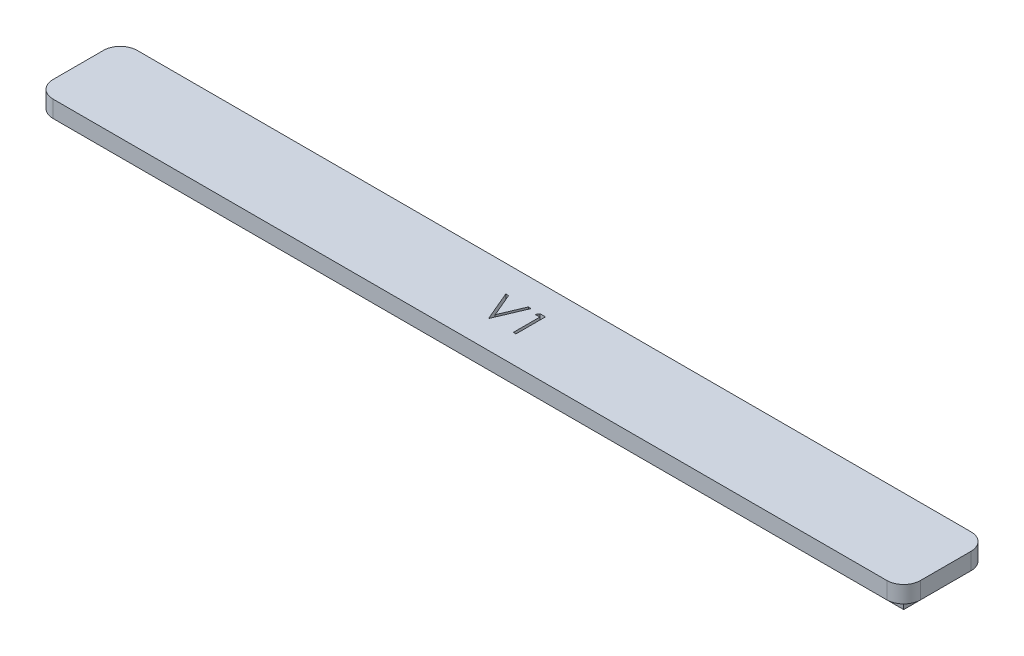
ISO-10303-21;
HEADER;
FILE_DESCRIPTION(('STEP AP214'),'2;1');
FILE_NAME('part.step','',(''),(''),'','','');
FILE_SCHEMA(('AUTOMOTIVE_DESIGN { 1 0 10303 214 1 1 1 1 }'));
ENDSEC;
DATA;
#1=APPLICATION_CONTEXT('core data for automotive mechanical design processes');
#2=APPLICATION_PROTOCOL_DEFINITION('international standard','automotive_design',2000,#1);
#3=PRODUCT_CONTEXT('',#1,'mechanical');
#4=PRODUCT('Part','Part','',(#3));
#5=PRODUCT_RELATED_PRODUCT_CATEGORY('part','',(#4));
#6=PRODUCT_DEFINITION_FORMATION('','',#4);
#7=PRODUCT_DEFINITION_CONTEXT('part definition',#1,'design');
#8=PRODUCT_DEFINITION('design','',#6,#7);
#9=PRODUCT_DEFINITION_SHAPE('','',#8);
#10=(LENGTH_UNIT() NAMED_UNIT(*) SI_UNIT(.MILLI.,.METRE.));
#11=(NAMED_UNIT(*) PLANE_ANGLE_UNIT() SI_UNIT($,.RADIAN.));
#12=(NAMED_UNIT(*) SI_UNIT($,.STERADIAN.) SOLID_ANGLE_UNIT());
#13=UNCERTAINTY_MEASURE_WITH_UNIT(LENGTH_MEASURE(1.E-05),#10,'distance_accuracy_value','');
#14=(GEOMETRIC_REPRESENTATION_CONTEXT(3) GLOBAL_UNCERTAINTY_ASSIGNED_CONTEXT((#13)) GLOBAL_UNIT_ASSIGNED_CONTEXT((#10,
#11,#12)) REPRESENTATION_CONTEXT('',''));
#15=CARTESIAN_POINT('',(0.,0.,0.));
#16=DIRECTION('',(0.,0.,1.));
#17=DIRECTION('',(1.,0.,0.));
#18=AXIS2_PLACEMENT_3D('',#15,#16,#17);
#19=CARTESIAN_POINT('',(0.,4.,0.));
#20=DIRECTION('',(0.,1.,0.));
#21=DIRECTION('',(0.,0.,1.));
#22=AXIS2_PLACEMENT_3D('',#19,#20,#21);
#23=PLANE('',#22);
#24=DIRECTION('',(-1.,0.,0.));
#25=VECTOR('',#24,1.);
#26=CARTESIAN_POINT('',(51.5,4.,-5.));
#27=LINE('',#26,#25);
#28=CARTESIAN_POINT('',(49.5,4.,-5.));
#29=VERTEX_POINT('',#28);
#30=CARTESIAN_POINT('',(-49.5,4.,-5.));
#31=VERTEX_POINT('',#30);
#32=EDGE_CURVE('E284',#29,#31,#27,.T.);
#33=ORIENTED_EDGE('',*,*,#32,.T.);
#34=CARTESIAN_POINT('',(-49.5,4.,-3.));
#35=DIRECTION('',(0.,1.,0.));
#36=DIRECTION('',(0.,0.,1.));
#37=AXIS2_PLACEMENT_3D('',#34,#35,#36);
#38=CIRCLE('',#37,2.);
#39=CARTESIAN_POINT('',(-51.5,4.,-3.));
#40=VERTEX_POINT('',#39);
#41=EDGE_CURVE('E344',#31,#40,#38,.T.);
#42=ORIENTED_EDGE('',*,*,#41,.T.);
#43=DIRECTION('',(0.,0.,1.));
#44=VECTOR('',#43,1.);
#45=CARTESIAN_POINT('',(-51.5,4.,-5.));
#46=LINE('',#45,#44);
#47=CARTESIAN_POINT('',(-51.5,4.,3.));
#48=VERTEX_POINT('',#47);
#49=EDGE_CURVE('E229',#40,#48,#46,.T.);
#50=ORIENTED_EDGE('',*,*,#49,.T.);
#51=CARTESIAN_POINT('',(-49.5,4.,3.));
#52=DIRECTION('',(0.,1.,0.));
#53=DIRECTION('',(0.,0.,1.));
#54=AXIS2_PLACEMENT_3D('',#51,#52,#53);
#55=CIRCLE('',#54,2.);
#56=CARTESIAN_POINT('',(-49.5,4.,5.));
#57=VERTEX_POINT('',#56);
#58=EDGE_CURVE('E338',#48,#57,#55,.T.);
#59=ORIENTED_EDGE('',*,*,#58,.T.);
#60=DIRECTION('',(1.,0.,0.));
#61=VECTOR('',#60,1.);
#62=CARTESIAN_POINT('',(-51.5,4.,5.));
#63=LINE('',#62,#61);
#64=CARTESIAN_POINT('',(49.5,4.,5.));
#65=VERTEX_POINT('',#64);
#66=EDGE_CURVE('E233',#57,#65,#63,.T.);
#67=ORIENTED_EDGE('',*,*,#66,.T.);
#68=CARTESIAN_POINT('',(49.5,4.,3.));
#69=DIRECTION('',(0.,1.,0.));
#70=DIRECTION('',(0.,0.,1.));
#71=AXIS2_PLACEMENT_3D('',#68,#69,#70);
#72=CIRCLE('',#71,2.);
#73=CARTESIAN_POINT('',(51.5,4.,3.));
#74=VERTEX_POINT('',#73);
#75=EDGE_CURVE('E340',#65,#74,#72,.T.);
#76=ORIENTED_EDGE('',*,*,#75,.T.);
#77=DIRECTION('',(0.,0.,-1.));
#78=VECTOR('',#77,1.);
#79=CARTESIAN_POINT('',(51.5,4.,5.));
#80=LINE('',#79,#78);
#81=CARTESIAN_POINT('',(51.5,4.,-3.));
#82=VERTEX_POINT('',#81);
#83=EDGE_CURVE('E296',#74,#82,#80,.T.);
#84=ORIENTED_EDGE('',*,*,#83,.T.);
#85=CARTESIAN_POINT('',(49.5,4.,-3.));
#86=DIRECTION('',(0.,1.,0.));
#87=DIRECTION('',(0.,0.,1.));
#88=AXIS2_PLACEMENT_3D('',#85,#86,#87);
#89=CIRCLE('',#88,2.);
#90=EDGE_CURVE('E342',#82,#29,#89,.T.);
#91=ORIENTED_EDGE('',*,*,#90,.T.);
#92=EDGE_LOOP('',(#33,#42,#50,#59,#67,#76,#84,#91));
#93=FACE_BOUND('',#92,.T.);
#94=DIRECTION('',(-1.,0.,0.));
#95=VECTOR('',#94,1.);
#96=CARTESIAN_POINT('',(1.82228761965457,4.,-1.47577383010594));
#97=LINE('',#96,#95);
#98=CARTESIAN_POINT('',(1.82228761965457,4.,-1.47577383010594));
#99=VERTEX_POINT('',#98);
#100=CARTESIAN_POINT('',(1.28382608119303,4.,-1.47577383010594));
#101=VERTEX_POINT('',#100);
#102=EDGE_CURVE('E243',#99,#101,#97,.T.);
#103=ORIENTED_EDGE('',*,*,#102,.T.);
#104=DIRECTION('',(0.496686511837685,0.,-0.867930013859708));
#105=VECTOR('',#104,1.);
#106=CARTESIAN_POINT('',(1.28382608119303,4.,-1.47577383010594));
#107=LINE('',#106,#105);
#108=CARTESIAN_POINT('',(1.48925476709047,4.,-1.8347481890803));
#109=VERTEX_POINT('',#108);
#110=EDGE_CURVE('E62',#101,#109,#107,.T.);
#111=ORIENTED_EDGE('',*,*,#110,.T.);
#112=DIRECTION('',(1.,0.,0.));
#113=VECTOR('',#112,1.);
#114=CARTESIAN_POINT('',(1.48925476709047,4.,-1.8347481890803));
#115=LINE('',#114,#113);
#116=CARTESIAN_POINT('',(2.13639018375714,4.,-1.8347481890803));
#117=VERTEX_POINT('',#116);
#118=EDGE_CURVE('E255',#109,#117,#115,.T.);
#119=ORIENTED_EDGE('',*,*,#118,.T.);
#120=DIRECTION('',(0.,0.,1.));
#121=VECTOR('',#120,1.);
#122=CARTESIAN_POINT('',(2.13639018375714,4.,-1.8347481890803));
#123=LINE('',#122,#121);
#124=CARTESIAN_POINT('',(2.13639018375714,4.,1.6652518109197));
#125=VERTEX_POINT('',#124);
#126=EDGE_CURVE('E258',#117,#125,#123,.T.);
#127=ORIENTED_EDGE('',*,*,#126,.T.);
#128=DIRECTION('',(-1.,0.,0.));
#129=VECTOR('',#128,1.);
#130=CARTESIAN_POINT('',(2.13639018375714,4.,1.6652518109197));
#131=LINE('',#130,#129);
#132=CARTESIAN_POINT('',(1.82228761965457,4.,1.6652518109197));
#133=VERTEX_POINT('',#132);
#134=EDGE_CURVE('E261',#125,#133,#131,.T.);
#135=ORIENTED_EDGE('',*,*,#134,.T.);
#136=DIRECTION('',(0.,0.,-1.));
#137=VECTOR('',#136,1.);
#138=CARTESIAN_POINT('',(1.82228761965457,4.,1.6652518109197));
#139=LINE('',#138,#137);
#140=EDGE_CURVE('E264',#133,#99,#139,.T.);
#141=ORIENTED_EDGE('',*,*,#140,.T.);
#142=EDGE_LOOP('',(#103,#111,#119,#127,#135,#141));
#143=FACE_BOUND('',#142,.T.);
#144=DIRECTION('',(-1.,0.,0.));
#145=VECTOR('',#144,1.);
#146=CARTESIAN_POINT('',(-1.0495072521403,4.,1.6652518109197));
#147=LINE('',#146,#145);
#148=CARTESIAN_POINT('',(-1.0495072521403,4.,1.6652518109197));
#149=VERTEX_POINT('',#148);
#150=CARTESIAN_POINT('',(-1.0943790470121,4.,1.6652518109197));
#151=VERTEX_POINT('',#150);
#152=EDGE_CURVE('E224',#149,#151,#147,.T.);
#153=ORIENTED_EDGE('',*,*,#152,.T.);
#154=DIRECTION('',(-0.389639990836698,0.,-0.920967251068559));
#155=VECTOR('',#154,1.);
#156=CARTESIAN_POINT('',(-1.0943790470121,4.,1.6652518109197));
#157=LINE('',#156,#155);
#158=CARTESIAN_POINT('',(-2.57514827778133,4.,-1.8347481890803));
#159=VERTEX_POINT('',#158);
#160=EDGE_CURVE('E54',#151,#159,#157,.T.);
#161=ORIENTED_EDGE('',*,*,#160,.T.);
#162=DIRECTION('',(1.,0.,0.));
#163=VECTOR('',#162,1.);
#164=CARTESIAN_POINT('',(-2.57514827778133,4.,-1.8347481890803));
#165=LINE('',#164,#163);
#166=CARTESIAN_POINT('',(-2.23860981624286,4.,-1.8347481890803));
#167=VERTEX_POINT('',#166);
#168=EDGE_CURVE('E228',#159,#167,#165,.T.);
#169=ORIENTED_EDGE('',*,*,#168,.T.);
#170=DIRECTION('',(0.389563616454194,0.,0.920999559573798));
#171=VECTOR('',#170,1.);
#172=CARTESIAN_POINT('',(-2.23860981624286,4.,-1.8347481890803));
#173=LINE('',#172,#171);
#174=CARTESIAN_POINT('',(-1.0719431495762,4.,0.92346495194534));
#175=VERTEX_POINT('',#174);
#176=EDGE_CURVE('E709',#167,#175,#173,.T.);
#177=ORIENTED_EDGE('',*,*,#176,.T.);
#178=DIRECTION('',(0.389563616454194,0.,-0.920999559573798));
#179=VECTOR('',#178,1.);
#180=CARTESIAN_POINT('',(-1.0719431495762,4.,0.92346495194534));
#181=LINE('',#180,#179);
#182=CARTESIAN_POINT('',(0.0947235170904682,4.,-1.8347481890803));
#183=VERTEX_POINT('',#182);
#184=EDGE_CURVE('E695',#175,#183,#181,.T.);
#185=ORIENTED_EDGE('',*,*,#184,.T.);
#186=DIRECTION('',(1.,0.,0.));
#187=VECTOR('',#186,1.);
#188=CARTESIAN_POINT('',(0.0947235170904682,4.,-1.8347481890803));
#189=LINE('',#188,#187);
#190=CARTESIAN_POINT('',(0.43126197862893,4.,-1.8347481890803));
#191=VERTEX_POINT('',#190);
#192=EDGE_CURVE('E692',#183,#191,#189,.T.);
#193=ORIENTED_EDGE('',*,*,#192,.T.);
#194=DIRECTION('',(-0.389639990836698,0.,0.920967251068559));
#195=VECTOR('',#194,1.);
#196=CARTESIAN_POINT('',(0.43126197862893,4.,-1.8347481890803));
#197=LINE('',#196,#195);
#198=EDGE_CURVE('E686',#191,#149,#197,.T.);
#199=ORIENTED_EDGE('',*,*,#198,.T.);
#200=EDGE_LOOP('',(#153,#161,#169,#177,#185,#193,#199));
#201=FACE_BOUND('',#200,.T.);
#202=ADVANCED_FACE('F39',(#93,#143,#201),#23,.T.);
#203=CARTESIAN_POINT('',(49.5,0.,-3.));
#204=DIRECTION('',(0.984807753012208,-0.173648177666931,0.));
#205=DIRECTION('',(0.173648177666931,0.984807753012208,0.));
#206=AXIS2_PLACEMENT_3D('',#203,#204,#205);
#207=PLANE('',#206);
#208=DIRECTION('',(0.,0.,-1.));
#209=VECTOR('',#208,1.);
#210=CARTESIAN_POINT('',(49.5,0.,-3.));
#211=LINE('',#210,#209);
#212=CARTESIAN_POINT('',(49.5,0.,3.));
#213=VERTEX_POINT('',#212);
#214=CARTESIAN_POINT('',(49.5,0.,-3.));
#215=VERTEX_POINT('',#214);
#216=EDGE_CURVE('E292',#213,#215,#211,.T.);
#217=ORIENTED_EDGE('',*,*,#216,.T.);
#218=DIRECTION('',(-0.171087869746036,-0.970287525247814,0.171087869746036));
#219=VECTOR('',#218,1.);
#220=CARTESIAN_POINT('',(46.6021651417506,-16.4344381478444,-0.102165141750576));
#221=LINE('',#220,#219);
#222=CARTESIAN_POINT('',(49.852653961417,2.,-3.35265396141693));
#223=VERTEX_POINT('',#222);
#224=EDGE_CURVE('E310',#223,#215,#221,.T.);
#225=ORIENTED_EDGE('',*,*,#224,.F.);
#226=DIRECTION('',(0.,0.,1.));
#227=VECTOR('',#226,1.);
#228=CARTESIAN_POINT('',(49.852653961417,2.,-3.));
#229=LINE('',#228,#227);
#230=CARTESIAN_POINT('',(49.852653961417,2.,3.35265396141693));
#231=VERTEX_POINT('',#230);
#232=EDGE_CURVE('E309',#231,#223,#229,.F.);
#233=ORIENTED_EDGE('',*,*,#232,.F.);
#234=DIRECTION('',(-0.171087869746036,-0.970287525247814,-0.171087869746036));
#235=VECTOR('',#234,1.);
#236=CARTESIAN_POINT('',(49.3243736449546,-0.996026554414807,2.82437364495458));
#237=LINE('',#236,#235);
#238=EDGE_CURVE('E315',#231,#213,#237,.T.);
#239=ORIENTED_EDGE('',*,*,#238,.T.);
#240=EDGE_LOOP('',(#217,#225,#233,#239));
#241=FACE_BOUND('',#240,.T.);
#242=ADVANCED_FACE('F410',(#241),#207,.T.);
#243=CARTESIAN_POINT('',(-49.5,0.,-3.));
#244=DIRECTION('',(0.,-0.173648177666931,-0.984807753012208));
#245=DIRECTION('',(0.,0.984807753012208,-0.173648177666931));
#246=AXIS2_PLACEMENT_3D('',#243,#244,#245);
#247=PLANE('',#246);
#248=DIRECTION('',(-1.,0.,0.));
#249=VECTOR('',#248,1.);
#250=CARTESIAN_POINT('',(-49.5,0.,-3.));
#251=LINE('',#250,#249);
#252=CARTESIAN_POINT('',(-49.5,0.,-3.));
#253=VERTEX_POINT('',#252);
#254=EDGE_CURVE('E303',#215,#253,#251,.T.);
#255=ORIENTED_EDGE('',*,*,#254,.T.);
#256=DIRECTION('',(0.171087869746036,-0.970287525247814,0.171087869746036));
#257=VECTOR('',#256,1.);
#258=CARTESIAN_POINT('',(-49.5,0.,-3.));
#259=LINE('',#258,#257);
#260=CARTESIAN_POINT('',(-49.8526539614169,2.,-3.35265396141693));
#261=VERTEX_POINT('',#260);
#262=EDGE_CURVE('E314',#261,#253,#259,.T.);
#263=ORIENTED_EDGE('',*,*,#262,.F.);
#264=DIRECTION('',(1.,0.,0.));
#265=VECTOR('',#264,1.);
#266=CARTESIAN_POINT('',(-49.5,2.,-3.35265396141693));
#267=LINE('',#266,#265);
#268=EDGE_CURVE('E326',#223,#261,#267,.F.);
#269=ORIENTED_EDGE('',*,*,#268,.F.);
#270=ORIENTED_EDGE('',*,*,#224,.T.);
#271=EDGE_LOOP('',(#255,#263,#269,#270));
#272=FACE_BOUND('',#271,.T.);
#273=ADVANCED_FACE('F417',(#272),#247,.T.);
#274=CARTESIAN_POINT('',(-49.5,0.,-3.));
#275=DIRECTION('',(-0.984807753012208,-0.173648177666931,0.));
#276=DIRECTION('',(0.173648177666931,-0.984807753012208,0.));
#277=AXIS2_PLACEMENT_3D('',#274,#275,#276);
#278=PLANE('',#277);
#279=DIRECTION('',(0.,0.,1.));
#280=VECTOR('',#279,1.);
#281=CARTESIAN_POINT('',(-49.5,0.,-3.));
#282=LINE('',#281,#280);
#283=CARTESIAN_POINT('',(-49.5,0.,3.));
#284=VERTEX_POINT('',#283);
#285=EDGE_CURVE('E305',#253,#284,#282,.T.);
#286=ORIENTED_EDGE('',*,*,#285,.T.);
#287=DIRECTION('',(0.171087869746036,-0.970287525247814,-0.171087869746036));
#288=VECTOR('',#287,1.);
#289=CARTESIAN_POINT('',(-49.5,0.,3.));
#290=LINE('',#289,#288);
#291=CARTESIAN_POINT('',(-49.8526539614169,2.,3.35265396141693));
#292=VERTEX_POINT('',#291);
#293=EDGE_CURVE('E318',#292,#284,#290,.T.);
#294=ORIENTED_EDGE('',*,*,#293,.F.);
#295=DIRECTION('',(0.,0.,-1.));
#296=VECTOR('',#295,1.);
#297=CARTESIAN_POINT('',(-49.8526539614169,2.,-3.));
#298=LINE('',#297,#296);
#299=EDGE_CURVE('E329',#261,#292,#298,.F.);
#300=ORIENTED_EDGE('',*,*,#299,.F.);
#301=ORIENTED_EDGE('',*,*,#262,.T.);
#302=EDGE_LOOP('',(#286,#294,#300,#301));
#303=FACE_BOUND('',#302,.T.);
#304=ADVANCED_FACE('F433',(#303),#278,.T.);
#305=CARTESIAN_POINT('',(-49.5,0.,3.));
#306=DIRECTION('',(0.,-0.173648177666931,0.984807753012208));
#307=DIRECTION('',(0.,-0.984807753012208,-0.173648177666931));
#308=AXIS2_PLACEMENT_3D('',#305,#306,#307);
#309=PLANE('',#308);
#310=DIRECTION('',(1.,0.,0.));
#311=VECTOR('',#310,1.);
#312=CARTESIAN_POINT('',(-49.5,0.,3.));
#313=LINE('',#312,#311);
#314=EDGE_CURVE('E307',#284,#213,#313,.T.);
#315=ORIENTED_EDGE('',*,*,#314,.T.);
#316=ORIENTED_EDGE('',*,*,#238,.F.);
#317=DIRECTION('',(-1.,0.,0.));
#318=VECTOR('',#317,1.);
#319=CARTESIAN_POINT('',(-49.5,2.,3.35265396141693));
#320=LINE('',#319,#318);
#321=EDGE_CURVE('E319',#292,#231,#320,.F.);
#322=ORIENTED_EDGE('',*,*,#321,.F.);
#323=ORIENTED_EDGE('',*,*,#293,.T.);
#324=EDGE_LOOP('',(#315,#316,#322,#323));
#325=FACE_BOUND('',#324,.T.);
#326=ADVANCED_FACE('F428',(#325),#309,.T.);
#327=CARTESIAN_POINT('',(0.,0.,0.));
#328=DIRECTION('',(0.,1.,0.));
#329=DIRECTION('',(0.,0.,1.));
#330=AXIS2_PLACEMENT_3D('',#327,#328,#329);
#331=PLANE('',#330);
#332=ORIENTED_EDGE('',*,*,#216,.F.);
#333=ORIENTED_EDGE('',*,*,#314,.F.);
#334=ORIENTED_EDGE('',*,*,#285,.F.);
#335=ORIENTED_EDGE('',*,*,#254,.F.);
#336=EDGE_LOOP('',(#332,#333,#334,#335));
#337=FACE_BOUND('',#336,.T.);
#338=ADVANCED_FACE('F425',(#337),#331,.F.);
#339=CARTESIAN_POINT('',(0.,2.,0.));
#340=DIRECTION('',(0.,1.,0.));
#341=DIRECTION('',(0.,0.,1.));
#342=AXIS2_PLACEMENT_3D('',#339,#340,#341);
#343=PLANE('',#342);
#344=ORIENTED_EDGE('',*,*,#321,.T.);
#345=ORIENTED_EDGE('',*,*,#232,.T.);
#346=ORIENTED_EDGE('',*,*,#268,.T.);
#347=ORIENTED_EDGE('',*,*,#299,.T.);
#348=EDGE_LOOP('',(#344,#345,#346,#347));
#349=FACE_BOUND('',#348,.T.);
#350=DIRECTION('',(0.,0.,1.));
#351=VECTOR('',#350,1.);
#352=CARTESIAN_POINT('',(-51.5,2.,-5.));
#353=LINE('',#352,#351);
#354=CARTESIAN_POINT('',(-51.5,2.,-3.));
#355=VERTEX_POINT('',#354);
#356=CARTESIAN_POINT('',(-51.5,2.,3.));
#357=VERTEX_POINT('',#356);
#358=EDGE_CURVE('E280',#355,#357,#353,.T.);
#359=ORIENTED_EDGE('',*,*,#358,.F.);
#360=CARTESIAN_POINT('',(-49.5,2.,-3.));
#361=DIRECTION('',(0.,1.,0.));
#362=DIRECTION('',(0.,0.,1.));
#363=AXIS2_PLACEMENT_3D('',#360,#361,#362);
#364=CIRCLE('',#363,2.);
#365=CARTESIAN_POINT('',(-49.5,2.,-5.));
#366=VERTEX_POINT('',#365);
#367=EDGE_CURVE('E357',#355,#366,#364,.F.);
#368=ORIENTED_EDGE('',*,*,#367,.T.);
#369=DIRECTION('',(-1.,0.,0.));
#370=VECTOR('',#369,1.);
#371=CARTESIAN_POINT('',(51.5,2.,-5.));
#372=LINE('',#371,#370);
#373=CARTESIAN_POINT('',(49.5,2.,-5.));
#374=VERTEX_POINT('',#373);
#375=EDGE_CURVE('E290',#374,#366,#372,.T.);
#376=ORIENTED_EDGE('',*,*,#375,.F.);
#377=CARTESIAN_POINT('',(49.5,2.,-3.));
#378=DIRECTION('',(0.,1.,0.));
#379=DIRECTION('',(0.,0.,1.));
#380=AXIS2_PLACEMENT_3D('',#377,#378,#379);
#381=CIRCLE('',#380,2.);
#382=CARTESIAN_POINT('',(51.5,2.,-3.));
#383=VERTEX_POINT('',#382);
#384=EDGE_CURVE('E355',#374,#383,#381,.F.);
#385=ORIENTED_EDGE('',*,*,#384,.T.);
#386=DIRECTION('',(0.,0.,-1.));
#387=VECTOR('',#386,1.);
#388=CARTESIAN_POINT('',(51.5,2.,5.));
#389=LINE('',#388,#387);
#390=CARTESIAN_POINT('',(51.5,2.,3.));
#391=VERTEX_POINT('',#390);
#392=EDGE_CURVE('E287',#391,#383,#389,.T.);
#393=ORIENTED_EDGE('',*,*,#392,.F.);
#394=CARTESIAN_POINT('',(49.5,2.,3.));
#395=DIRECTION('',(0.,1.,0.));
#396=DIRECTION('',(0.,0.,1.));
#397=AXIS2_PLACEMENT_3D('',#394,#395,#396);
#398=CIRCLE('',#397,2.);
#399=CARTESIAN_POINT('',(49.5,2.,5.));
#400=VERTEX_POINT('',#399);
#401=EDGE_CURVE('E353',#391,#400,#398,.F.);
#402=ORIENTED_EDGE('',*,*,#401,.T.);
#403=DIRECTION('',(1.,0.,0.));
#404=VECTOR('',#403,1.);
#405=CARTESIAN_POINT('',(-51.5,2.,5.));
#406=LINE('',#405,#404);
#407=CARTESIAN_POINT('',(-49.5,2.,5.));
#408=VERTEX_POINT('',#407);
#409=EDGE_CURVE('E283',#408,#400,#406,.T.);
#410=ORIENTED_EDGE('',*,*,#409,.F.);
#411=CARTESIAN_POINT('',(-49.5,2.,3.));
#412=DIRECTION('',(0.,1.,0.));
#413=DIRECTION('',(0.,0.,1.));
#414=AXIS2_PLACEMENT_3D('',#411,#412,#413);
#415=CIRCLE('',#414,2.);
#416=EDGE_CURVE('E351',#408,#357,#415,.F.);
#417=ORIENTED_EDGE('',*,*,#416,.T.);
#418=EDGE_LOOP('',(#359,#368,#376,#385,#393,#402,#410,#417));
#419=FACE_BOUND('',#418,.T.);
#420=ADVANCED_FACE('F373',(#349,#419),#343,.F.);
#421=CARTESIAN_POINT('',(-51.5,2.,-5.));
#422=DIRECTION('',(-1.,0.,0.));
#423=DIRECTION('',(0.,0.,1.));
#424=AXIS2_PLACEMENT_3D('',#421,#422,#423);
#425=PLANE('',#424);
#426=ORIENTED_EDGE('',*,*,#49,.F.);
#427=DIRECTION('',(0.,1.,0.));
#428=VECTOR('',#427,1.);
#429=CARTESIAN_POINT('',(-51.5,2.,-3.));
#430=LINE('',#429,#428);
#431=EDGE_CURVE('E349',#40,#355,#430,.F.);
#432=ORIENTED_EDGE('',*,*,#431,.T.);
#433=ORIENTED_EDGE('',*,*,#358,.T.);
#434=DIRECTION('',(0.,1.,0.));
#435=VECTOR('',#434,1.);
#436=CARTESIAN_POINT('',(-51.5,2.,3.));
#437=LINE('',#436,#435);
#438=EDGE_CURVE('E346',#357,#48,#437,.T.);
#439=ORIENTED_EDGE('',*,*,#438,.T.);
#440=EDGE_LOOP('',(#426,#432,#433,#439));
#441=FACE_BOUND('',#440,.T.);
#442=ADVANCED_FACE('F379',(#441),#425,.T.);
#443=CARTESIAN_POINT('',(51.5,2.,-5.));
#444=DIRECTION('',(0.,0.,-1.));
#445=DIRECTION('',(-1.,0.,0.));
#446=AXIS2_PLACEMENT_3D('',#443,#444,#445);
#447=PLANE('',#446);
#448=ORIENTED_EDGE('',*,*,#375,.T.);
#449=DIRECTION('',(0.,1.,0.));
#450=VECTOR('',#449,1.);
#451=CARTESIAN_POINT('',(-49.5,2.,-5.));
#452=LINE('',#451,#450);
#453=EDGE_CURVE('E335',#366,#31,#452,.T.);
#454=ORIENTED_EDGE('',*,*,#453,.T.);
#455=ORIENTED_EDGE('',*,*,#32,.F.);
#456=DIRECTION('',(0.,1.,0.));
#457=VECTOR('',#456,1.);
#458=CARTESIAN_POINT('',(49.5,2.,-5.));
#459=LINE('',#458,#457);
#460=EDGE_CURVE('E313',#29,#374,#459,.F.);
#461=ORIENTED_EDGE('',*,*,#460,.T.);
#462=EDGE_LOOP('',(#448,#454,#455,#461));
#463=FACE_BOUND('',#462,.T.);
#464=ADVANCED_FACE('F389',(#463),#447,.T.);
#465=CARTESIAN_POINT('',(51.5,2.,5.));
#466=DIRECTION('',(1.,0.,0.));
#467=DIRECTION('',(0.,0.,-1.));
#468=AXIS2_PLACEMENT_3D('',#465,#466,#467);
#469=PLANE('',#468);
#470=ORIENTED_EDGE('',*,*,#392,.T.);
#471=DIRECTION('',(0.,1.,0.));
#472=VECTOR('',#471,1.);
#473=CARTESIAN_POINT('',(51.5,2.,-3.));
#474=LINE('',#473,#472);
#475=EDGE_CURVE('E361',#383,#82,#474,.T.);
#476=ORIENTED_EDGE('',*,*,#475,.T.);
#477=ORIENTED_EDGE('',*,*,#83,.F.);
#478=DIRECTION('',(0.,1.,0.));
#479=VECTOR('',#478,1.);
#480=CARTESIAN_POINT('',(51.5,2.,3.));
#481=LINE('',#480,#479);
#482=EDGE_CURVE('E359',#74,#391,#481,.F.);
#483=ORIENTED_EDGE('',*,*,#482,.T.);
#484=EDGE_LOOP('',(#470,#476,#477,#483));
#485=FACE_BOUND('',#484,.T.);
#486=ADVANCED_FACE('F398',(#485),#469,.T.);
#487=CARTESIAN_POINT('',(-51.5,2.,5.));
#488=DIRECTION('',(0.,0.,1.));
#489=DIRECTION('',(1.,0.,0.));
#490=AXIS2_PLACEMENT_3D('',#487,#488,#489);
#491=PLANE('',#490);
#492=ORIENTED_EDGE('',*,*,#409,.T.);
#493=DIRECTION('',(0.,1.,0.));
#494=VECTOR('',#493,1.);
#495=CARTESIAN_POINT('',(49.5,2.,5.));
#496=LINE('',#495,#494);
#497=EDGE_CURVE('E11',#400,#65,#496,.T.);
#498=ORIENTED_EDGE('',*,*,#497,.T.);
#499=ORIENTED_EDGE('',*,*,#66,.F.);
#500=DIRECTION('',(0.,1.,0.));
#501=VECTOR('',#500,1.);
#502=CARTESIAN_POINT('',(-49.5,2.,5.));
#503=LINE('',#502,#501);
#504=EDGE_CURVE('E47',#57,#408,#503,.F.);
#505=ORIENTED_EDGE('',*,*,#504,.T.);
#506=EDGE_LOOP('',(#492,#498,#499,#505));
#507=FACE_BOUND('',#506,.T.);
#508=ADVANCED_FACE('F367',(#507),#491,.T.);
#509=CARTESIAN_POINT('',(-49.5,2.,-3.));
#510=DIRECTION('',(0.,1.,0.));
#511=DIRECTION('',(0.,0.,1.));
#512=AXIS2_PLACEMENT_3D('',#509,#510,#511);
#513=CYLINDRICAL_SURFACE('',#512,2.);
#514=ORIENTED_EDGE('',*,*,#367,.F.);
#515=ORIENTED_EDGE('',*,*,#431,.F.);
#516=ORIENTED_EDGE('',*,*,#41,.F.);
#517=ORIENTED_EDGE('',*,*,#453,.F.);
#518=EDGE_LOOP('',(#514,#515,#516,#517));
#519=FACE_BOUND('',#518,.T.);
#520=ADVANCED_FACE('F387',(#519),#513,.T.);
#521=CARTESIAN_POINT('',(49.5,2.,-3.));
#522=DIRECTION('',(0.,1.,0.));
#523=DIRECTION('',(0.,0.,1.));
#524=AXIS2_PLACEMENT_3D('',#521,#522,#523);
#525=CYLINDRICAL_SURFACE('',#524,2.);
#526=ORIENTED_EDGE('',*,*,#384,.F.);
#527=ORIENTED_EDGE('',*,*,#460,.F.);
#528=ORIENTED_EDGE('',*,*,#90,.F.);
#529=ORIENTED_EDGE('',*,*,#475,.F.);
#530=EDGE_LOOP('',(#526,#527,#528,#529));
#531=FACE_BOUND('',#530,.T.);
#532=ADVANCED_FACE('F395',(#531),#525,.T.);
#533=CARTESIAN_POINT('',(49.5,2.,3.));
#534=DIRECTION('',(0.,1.,0.));
#535=DIRECTION('',(0.,0.,1.));
#536=AXIS2_PLACEMENT_3D('',#533,#534,#535);
#537=CYLINDRICAL_SURFACE('',#536,2.);
#538=ORIENTED_EDGE('',*,*,#401,.F.);
#539=ORIENTED_EDGE('',*,*,#482,.F.);
#540=ORIENTED_EDGE('',*,*,#75,.F.);
#541=ORIENTED_EDGE('',*,*,#497,.F.);
#542=EDGE_LOOP('',(#538,#539,#540,#541));
#543=FACE_BOUND('',#542,.T.);
#544=ADVANCED_FACE('F401',(#543),#537,.T.);
#545=CARTESIAN_POINT('',(-49.5,2.,3.));
#546=DIRECTION('',(0.,1.,0.));
#547=DIRECTION('',(0.,0.,1.));
#548=AXIS2_PLACEMENT_3D('',#545,#546,#547);
#549=CYLINDRICAL_SURFACE('',#548,2.);
#550=ORIENTED_EDGE('',*,*,#416,.F.);
#551=ORIENTED_EDGE('',*,*,#504,.F.);
#552=ORIENTED_EDGE('',*,*,#58,.F.);
#553=ORIENTED_EDGE('',*,*,#438,.F.);
#554=EDGE_LOOP('',(#550,#551,#552,#553));
#555=FACE_BOUND('',#554,.T.);
#556=ADVANCED_FACE('F41',(#555),#549,.T.);
#557=CARTESIAN_POINT('',(1.28382608119303,3.,-1.47577383010594));
#558=DIRECTION('',(0.867930013859708,0.,0.496686511837685));
#559=DIRECTION('',(0.496686511837685,0.,-0.867930013859708));
#560=AXIS2_PLACEMENT_3D('',#557,#558,#559);
#561=PLANE('',#560);
#562=ORIENTED_EDGE('',*,*,#110,.F.);
#563=DIRECTION('',(0.,1.,0.));
#564=VECTOR('',#563,1.);
#565=CARTESIAN_POINT('',(1.28382608119303,3.,-1.47577383010594));
#566=LINE('',#565,#564);
#567=CARTESIAN_POINT('',(1.28382608119303,3.,-1.47577383010594));
#568=VERTEX_POINT('',#567);
#569=EDGE_CURVE('E253',#568,#101,#566,.T.);
#570=ORIENTED_EDGE('',*,*,#569,.F.);
#571=DIRECTION('',(0.496686511837685,0.,-0.867930013859708));
#572=VECTOR('',#571,1.);
#573=CARTESIAN_POINT('',(1.28382608119303,3.,-1.47577383010594));
#574=LINE('',#573,#572);
#575=CARTESIAN_POINT('',(1.48925476709047,3.,-1.8347481890803));
#576=VERTEX_POINT('',#575);
#577=EDGE_CURVE('E239',#568,#576,#574,.T.);
#578=ORIENTED_EDGE('',*,*,#577,.T.);
#579=DIRECTION('',(0.,1.,0.));
#580=VECTOR('',#579,1.);
#581=CARTESIAN_POINT('',(1.48925476709047,3.,-1.8347481890803));
#582=LINE('',#581,#580);
#583=EDGE_CURVE('E278',#576,#109,#582,.T.);
#584=ORIENTED_EDGE('',*,*,#583,.T.);
#585=EDGE_LOOP('',(#562,#570,#578,#584));
#586=FACE_BOUND('',#585,.T.);
#587=ADVANCED_FACE('F407',(#586),#561,.T.);
#588=CARTESIAN_POINT('',(1.48925476709047,3.,-1.8347481890803));
#589=DIRECTION('',(0.,0.,1.));
#590=DIRECTION('',(1.,0.,0.));
#591=AXIS2_PLACEMENT_3D('',#588,#589,#590);
#592=PLANE('',#591);
#593=ORIENTED_EDGE('',*,*,#118,.F.);
#594=ORIENTED_EDGE('',*,*,#583,.F.);
#595=DIRECTION('',(1.,0.,0.));
#596=VECTOR('',#595,1.);
#597=CARTESIAN_POINT('',(1.48925476709047,3.,-1.8347481890803));
#598=LINE('',#597,#596);
#599=CARTESIAN_POINT('',(2.13639018375714,3.,-1.8347481890803));
#600=VERTEX_POINT('',#599);
#601=EDGE_CURVE('E242',#576,#600,#598,.T.);
#602=ORIENTED_EDGE('',*,*,#601,.T.);
#603=DIRECTION('',(0.,1.,0.));
#604=VECTOR('',#603,1.);
#605=CARTESIAN_POINT('',(2.13639018375714,3.,-1.8347481890803));
#606=LINE('',#605,#604);
#607=EDGE_CURVE('E276',#600,#117,#606,.T.);
#608=ORIENTED_EDGE('',*,*,#607,.T.);
#609=EDGE_LOOP('',(#593,#594,#602,#608));
#610=FACE_BOUND('',#609,.T.);
#611=ADVANCED_FACE('F454',(#610),#592,.T.);
#612=CARTESIAN_POINT('',(2.13639018375714,3.,-1.8347481890803));
#613=DIRECTION('',(-1.,0.,0.));
#614=DIRECTION('',(0.,0.,1.));
#615=AXIS2_PLACEMENT_3D('',#612,#613,#614);
#616=PLANE('',#615);
#617=ORIENTED_EDGE('',*,*,#126,.F.);
#618=ORIENTED_EDGE('',*,*,#607,.F.);
#619=DIRECTION('',(0.,0.,1.));
#620=VECTOR('',#619,1.);
#621=CARTESIAN_POINT('',(2.13639018375714,3.,-1.8347481890803));
#622=LINE('',#621,#620);
#623=CARTESIAN_POINT('',(2.13639018375714,3.,1.6652518109197));
#624=VERTEX_POINT('',#623);
#625=EDGE_CURVE('E245',#600,#624,#622,.T.);
#626=ORIENTED_EDGE('',*,*,#625,.T.);
#627=DIRECTION('',(0.,1.,0.));
#628=VECTOR('',#627,1.);
#629=CARTESIAN_POINT('',(2.13639018375714,3.,1.6652518109197));
#630=LINE('',#629,#628);
#631=EDGE_CURVE('E274',#624,#125,#630,.T.);
#632=ORIENTED_EDGE('',*,*,#631,.T.);
#633=EDGE_LOOP('',(#617,#618,#626,#632));
#634=FACE_BOUND('',#633,.T.);
#635=ADVANCED_FACE('F457',(#634),#616,.T.);
#636=CARTESIAN_POINT('',(2.13639018375714,3.,1.6652518109197));
#637=DIRECTION('',(0.,0.,-1.));
#638=DIRECTION('',(-1.,0.,0.));
#639=AXIS2_PLACEMENT_3D('',#636,#637,#638);
#640=PLANE('',#639);
#641=ORIENTED_EDGE('',*,*,#134,.F.);
#642=ORIENTED_EDGE('',*,*,#631,.F.);
#643=DIRECTION('',(-1.,0.,0.));
#644=VECTOR('',#643,1.);
#645=CARTESIAN_POINT('',(2.13639018375714,3.,1.6652518109197));
#646=LINE('',#645,#644);
#647=CARTESIAN_POINT('',(1.82228761965457,3.,1.6652518109197));
#648=VERTEX_POINT('',#647);
#649=EDGE_CURVE('E247',#624,#648,#646,.T.);
#650=ORIENTED_EDGE('',*,*,#649,.T.);
#651=DIRECTION('',(0.,1.,0.));
#652=VECTOR('',#651,1.);
#653=CARTESIAN_POINT('',(1.82228761965457,3.,1.6652518109197));
#654=LINE('',#653,#652);
#655=EDGE_CURVE('E272',#648,#133,#654,.T.);
#656=ORIENTED_EDGE('',*,*,#655,.T.);
#657=EDGE_LOOP('',(#641,#642,#650,#656));
#658=FACE_BOUND('',#657,.T.);
#659=ADVANCED_FACE('F461',(#658),#640,.T.);
#660=CARTESIAN_POINT('',(1.82228761965457,3.,1.6652518109197));
#661=DIRECTION('',(1.,0.,0.));
#662=DIRECTION('',(0.,0.,-1.));
#663=AXIS2_PLACEMENT_3D('',#660,#661,#662);
#664=PLANE('',#663);
#665=ORIENTED_EDGE('',*,*,#140,.F.);
#666=ORIENTED_EDGE('',*,*,#655,.F.);
#667=DIRECTION('',(0.,0.,-1.));
#668=VECTOR('',#667,1.);
#669=CARTESIAN_POINT('',(1.82228761965457,3.,1.6652518109197));
#670=LINE('',#669,#668);
#671=CARTESIAN_POINT('',(1.82228761965457,3.,-1.47577383010594));
#672=VERTEX_POINT('',#671);
#673=EDGE_CURVE('E249',#648,#672,#670,.T.);
#674=ORIENTED_EDGE('',*,*,#673,.T.);
#675=DIRECTION('',(0.,1.,0.));
#676=VECTOR('',#675,1.);
#677=CARTESIAN_POINT('',(1.82228761965457,3.,-1.47577383010594));
#678=LINE('',#677,#676);
#679=EDGE_CURVE('E270',#672,#99,#678,.T.);
#680=ORIENTED_EDGE('',*,*,#679,.T.);
#681=EDGE_LOOP('',(#665,#666,#674,#680));
#682=FACE_BOUND('',#681,.T.);
#683=ADVANCED_FACE('F465',(#682),#664,.T.);
#684=CARTESIAN_POINT('',(1.82228761965457,3.,-1.47577383010594));
#685=DIRECTION('',(0.,0.,-1.));
#686=DIRECTION('',(-1.,0.,0.));
#687=AXIS2_PLACEMENT_3D('',#684,#685,#686);
#688=PLANE('',#687);
#689=ORIENTED_EDGE('',*,*,#102,.F.);
#690=ORIENTED_EDGE('',*,*,#679,.F.);
#691=DIRECTION('',(-1.,0.,0.));
#692=VECTOR('',#691,1.);
#693=CARTESIAN_POINT('',(1.82228761965457,3.,-1.47577383010594));
#694=LINE('',#693,#692);
#695=EDGE_CURVE('E251',#672,#568,#694,.T.);
#696=ORIENTED_EDGE('',*,*,#695,.T.);
#697=ORIENTED_EDGE('',*,*,#569,.T.);
#698=EDGE_LOOP('',(#689,#690,#696,#697));
#699=FACE_BOUND('',#698,.T.);
#700=ADVANCED_FACE('F469',(#699),#688,.T.);
#701=CARTESIAN_POINT('',(0.,3.,0.));
#702=DIRECTION('',(0.,-1.,0.));
#703=DIRECTION('',(0.,0.,-1.));
#704=AXIS2_PLACEMENT_3D('',#701,#702,#703);
#705=PLANE('',#704);
#706=ORIENTED_EDGE('',*,*,#577,.F.);
#707=ORIENTED_EDGE('',*,*,#695,.F.);
#708=ORIENTED_EDGE('',*,*,#673,.F.);
#709=ORIENTED_EDGE('',*,*,#649,.F.);
#710=ORIENTED_EDGE('',*,*,#625,.F.);
#711=ORIENTED_EDGE('',*,*,#601,.F.);
#712=EDGE_LOOP('',(#706,#707,#708,#709,#710,#711));
#713=FACE_BOUND('',#712,.T.);
#714=ADVANCED_FACE('F473',(#713),#705,.F.);
#715=CARTESIAN_POINT('',(-1.0943790470121,3.,1.6652518109197));
#716=DIRECTION('',(0.920967251068559,0.,-0.389639990836698));
#717=DIRECTION('',(-0.389639990836698,0.,-0.920967251068559));
#718=AXIS2_PLACEMENT_3D('',#715,#716,#717);
#719=PLANE('',#718);
#720=ORIENTED_EDGE('',*,*,#160,.F.);
#721=DIRECTION('',(0.,1.,0.));
#722=VECTOR('',#721,1.);
#723=CARTESIAN_POINT('',(-1.0943790470121,3.,1.6652518109197));
#724=LINE('',#723,#722);
#725=CARTESIAN_POINT('',(-1.0943790470121,3.,1.6652518109197));
#726=VERTEX_POINT('',#725);
#727=EDGE_CURVE('E223',#726,#151,#724,.T.);
#728=ORIENTED_EDGE('',*,*,#727,.F.);
#729=DIRECTION('',(-0.389639990836698,0.,-0.920967251068559));
#730=VECTOR('',#729,1.);
#731=CARTESIAN_POINT('',(-1.0943790470121,3.,1.6652518109197));
#732=LINE('',#731,#730);
#733=CARTESIAN_POINT('',(-2.57514827778133,3.,-1.8347481890803));
#734=VERTEX_POINT('',#733);
#735=EDGE_CURVE('E214',#726,#734,#732,.T.);
#736=ORIENTED_EDGE('',*,*,#735,.T.);
#737=DIRECTION('',(0.,1.,0.));
#738=VECTOR('',#737,1.);
#739=CARTESIAN_POINT('',(-2.57514827778133,3.,-1.8347481890803));
#740=LINE('',#739,#738);
#741=EDGE_CURVE('E222',#734,#159,#740,.T.);
#742=ORIENTED_EDGE('',*,*,#741,.T.);
#743=EDGE_LOOP('',(#720,#728,#736,#742));
#744=FACE_BOUND('',#743,.T.);
#745=ADVANCED_FACE('F221',(#744),#719,.T.);
#746=CARTESIAN_POINT('',(-2.57514827778133,3.,-1.8347481890803));
#747=DIRECTION('',(0.,0.,1.));
#748=DIRECTION('',(1.,0.,0.));
#749=AXIS2_PLACEMENT_3D('',#746,#747,#748);
#750=PLANE('',#749);
#751=ORIENTED_EDGE('',*,*,#168,.F.);
#752=ORIENTED_EDGE('',*,*,#741,.F.);
#753=DIRECTION('',(1.,0.,0.));
#754=VECTOR('',#753,1.);
#755=CARTESIAN_POINT('',(-2.57514827778133,3.,-1.8347481890803));
#756=LINE('',#755,#754);
#757=CARTESIAN_POINT('',(-2.23860981624286,3.,-1.8347481890803));
#758=VERTEX_POINT('',#757);
#759=EDGE_CURVE('E210',#734,#758,#756,.T.);
#760=ORIENTED_EDGE('',*,*,#759,.T.);
#761=DIRECTION('',(0.,1.,0.));
#762=VECTOR('',#761,1.);
#763=CARTESIAN_POINT('',(-2.23860981624286,3.,-1.8347481890803));
#764=LINE('',#763,#762);
#765=EDGE_CURVE('E230',#758,#167,#764,.T.);
#766=ORIENTED_EDGE('',*,*,#765,.T.);
#767=EDGE_LOOP('',(#751,#752,#760,#766));
#768=FACE_BOUND('',#767,.T.);
#769=ADVANCED_FACE('F226',(#768),#750,.T.);
#770=CARTESIAN_POINT('',(-2.23860981624286,3.,-1.8347481890803));
#771=DIRECTION('',(-0.920999559573798,0.,0.389563616454194));
#772=DIRECTION('',(0.389563616454194,0.,0.920999559573798));
#773=AXIS2_PLACEMENT_3D('',#770,#771,#772);
#774=PLANE('',#773);
#775=ORIENTED_EDGE('',*,*,#176,.F.);
#776=ORIENTED_EDGE('',*,*,#765,.F.);
#777=DIRECTION('',(0.389563616454194,0.,0.920999559573798));
#778=VECTOR('',#777,1.);
#779=CARTESIAN_POINT('',(-2.23860981624286,3.,-1.8347481890803));
#780=LINE('',#779,#778);
#781=CARTESIAN_POINT('',(-1.0719431495762,3.,0.92346495194534));
#782=VERTEX_POINT('',#781);
#783=EDGE_CURVE('E216',#758,#782,#780,.T.);
#784=ORIENTED_EDGE('',*,*,#783,.T.);
#785=DIRECTION('',(0.,1.,0.));
#786=VECTOR('',#785,1.);
#787=CARTESIAN_POINT('',(-1.0719431495762,3.,0.92346495194534));
#788=LINE('',#787,#786);
#789=EDGE_CURVE('E235',#782,#175,#788,.T.);
#790=ORIENTED_EDGE('',*,*,#789,.T.);
#791=EDGE_LOOP('',(#775,#776,#784,#790));
#792=FACE_BOUND('',#791,.T.);
#793=ADVANCED_FACE('F482',(#792),#774,.T.);
#794=CARTESIAN_POINT('',(-1.0719431495762,3.,0.92346495194534));
#795=DIRECTION('',(0.920999559573798,0.,0.389563616454194));
#796=DIRECTION('',(0.389563616454194,0.,-0.920999559573798));
#797=AXIS2_PLACEMENT_3D('',#794,#795,#796);
#798=PLANE('',#797);
#799=ORIENTED_EDGE('',*,*,#184,.F.);
#800=ORIENTED_EDGE('',*,*,#789,.F.);
#801=DIRECTION('',(0.389563616454194,0.,-0.920999559573798));
#802=VECTOR('',#801,1.);
#803=CARTESIAN_POINT('',(-1.0719431495762,3.,0.92346495194534));
#804=LINE('',#803,#802);
#805=CARTESIAN_POINT('',(0.0947235170904682,3.,-1.8347481890803));
#806=VERTEX_POINT('',#805);
#807=EDGE_CURVE('E720',#782,#806,#804,.T.);
#808=ORIENTED_EDGE('',*,*,#807,.T.);
#809=DIRECTION('',(0.,1.,0.));
#810=VECTOR('',#809,1.);
#811=CARTESIAN_POINT('',(0.0947235170904682,3.,-1.8347481890803));
#812=LINE('',#811,#810);
#813=EDGE_CURVE('E704',#806,#183,#812,.T.);
#814=ORIENTED_EDGE('',*,*,#813,.T.);
#815=EDGE_LOOP('',(#799,#800,#808,#814));
#816=FACE_BOUND('',#815,.T.);
#817=ADVANCED_FACE('F485',(#816),#798,.T.);
#818=CARTESIAN_POINT('',(0.0947235170904682,3.,-1.8347481890803));
#819=DIRECTION('',(0.,0.,1.));
#820=DIRECTION('',(1.,0.,0.));
#821=AXIS2_PLACEMENT_3D('',#818,#819,#820);
#822=PLANE('',#821);
#823=ORIENTED_EDGE('',*,*,#192,.F.);
#824=ORIENTED_EDGE('',*,*,#813,.F.);
#825=DIRECTION('',(1.,0.,0.));
#826=VECTOR('',#825,1.);
#827=CARTESIAN_POINT('',(0.0947235170904682,3.,-1.8347481890803));
#828=LINE('',#827,#826);
#829=CARTESIAN_POINT('',(0.43126197862893,3.,-1.8347481890803));
#830=VERTEX_POINT('',#829);
#831=EDGE_CURVE('E718',#806,#830,#828,.T.);
#832=ORIENTED_EDGE('',*,*,#831,.T.);
#833=DIRECTION('',(0.,1.,0.));
#834=VECTOR('',#833,1.);
#835=CARTESIAN_POINT('',(0.43126197862893,3.,-1.8347481890803));
#836=LINE('',#835,#834);
#837=EDGE_CURVE('E702',#830,#191,#836,.T.);
#838=ORIENTED_EDGE('',*,*,#837,.T.);
#839=EDGE_LOOP('',(#823,#824,#832,#838));
#840=FACE_BOUND('',#839,.T.);
#841=ADVANCED_FACE('F489',(#840),#822,.T.);
#842=CARTESIAN_POINT('',(0.43126197862893,3.,-1.8347481890803));
#843=DIRECTION('',(-0.920967251068559,0.,-0.389639990836698));
#844=DIRECTION('',(-0.389639990836698,0.,0.920967251068559));
#845=AXIS2_PLACEMENT_3D('',#842,#843,#844);
#846=PLANE('',#845);
#847=ORIENTED_EDGE('',*,*,#198,.F.);
#848=ORIENTED_EDGE('',*,*,#837,.F.);
#849=DIRECTION('',(-0.389639990836698,0.,0.920967251068559));
#850=VECTOR('',#849,1.);
#851=CARTESIAN_POINT('',(0.43126197862893,3.,-1.8347481890803));
#852=LINE('',#851,#850);
#853=CARTESIAN_POINT('',(-1.0495072521403,3.,1.6652518109197));
#854=VERTEX_POINT('',#853);
#855=EDGE_CURVE('E716',#830,#854,#852,.T.);
#856=ORIENTED_EDGE('',*,*,#855,.T.);
#857=DIRECTION('',(0.,1.,0.));
#858=VECTOR('',#857,1.);
#859=CARTESIAN_POINT('',(-1.0495072521403,3.,1.6652518109197));
#860=LINE('',#859,#858);
#861=EDGE_CURVE('E684',#854,#149,#860,.T.);
#862=ORIENTED_EDGE('',*,*,#861,.T.);
#863=EDGE_LOOP('',(#847,#848,#856,#862));
#864=FACE_BOUND('',#863,.T.);
#865=ADVANCED_FACE('F493',(#864),#846,.T.);
#866=CARTESIAN_POINT('',(-1.0495072521403,3.,1.6652518109197));
#867=DIRECTION('',(0.,0.,-1.));
#868=DIRECTION('',(-1.,0.,0.));
#869=AXIS2_PLACEMENT_3D('',#866,#867,#868);
#870=PLANE('',#869);
#871=ORIENTED_EDGE('',*,*,#152,.F.);
#872=ORIENTED_EDGE('',*,*,#861,.F.);
#873=DIRECTION('',(-1.,0.,0.));
#874=VECTOR('',#873,1.);
#875=CARTESIAN_POINT('',(-1.0495072521403,3.,1.6652518109197));
#876=LINE('',#875,#874);
#877=EDGE_CURVE('E700',#854,#726,#876,.T.);
#878=ORIENTED_EDGE('',*,*,#877,.T.);
#879=ORIENTED_EDGE('',*,*,#727,.T.);
#880=EDGE_LOOP('',(#871,#872,#878,#879));
#881=FACE_BOUND('',#880,.T.);
#882=ADVANCED_FACE('F497',(#881),#870,.T.);
#883=CARTESIAN_POINT('',(0.,3.,0.));
#884=DIRECTION('',(0.,-1.,0.));
#885=DIRECTION('',(0.,0.,-1.));
#886=AXIS2_PLACEMENT_3D('',#883,#884,#885);
#887=PLANE('',#886);
#888=ORIENTED_EDGE('',*,*,#735,.F.);
#889=ORIENTED_EDGE('',*,*,#877,.F.);
#890=ORIENTED_EDGE('',*,*,#855,.F.);
#891=ORIENTED_EDGE('',*,*,#831,.F.);
#892=ORIENTED_EDGE('',*,*,#807,.F.);
#893=ORIENTED_EDGE('',*,*,#783,.F.);
#894=ORIENTED_EDGE('',*,*,#759,.F.);
#895=EDGE_LOOP('',(#888,#889,#890,#891,#892,#893,#894));
#896=FACE_BOUND('',#895,.T.);
#897=ADVANCED_FACE('F212',(#896),#887,.F.);
#898=CLOSED_SHELL('',(#202,#242,#273,#304,#326,#338,#420,#442,#464,#486,#508,#520,#532,#544,
#556,#587,#611,#635,#659,#683,#700,#714,#745,#769,#793,#817,#841,#865,#882,#897));
#899=MANIFOLD_SOLID_BREP('B2',#898);
#900=ADVANCED_BREP_SHAPE_REPRESENTATION('',(#18,#899),#14);
#901=SHAPE_DEFINITION_REPRESENTATION(#9,#900);
ENDSEC;
END-ISO-10303-21;
